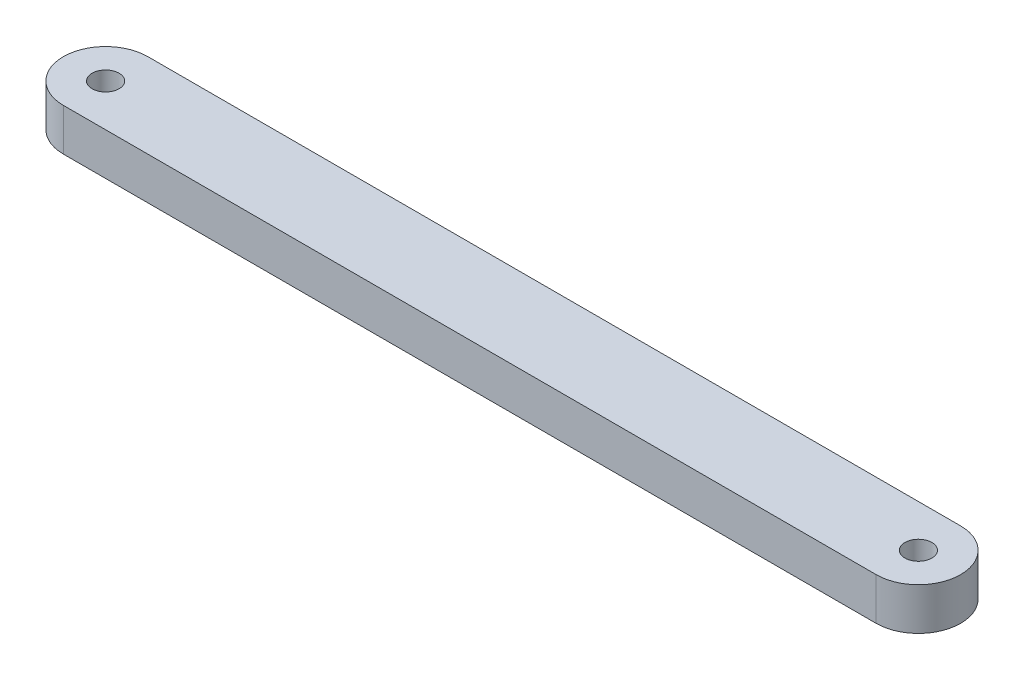
ISO-10303-21;
HEADER;
FILE_DESCRIPTION(('STEP AP214'),'2;1');
FILE_NAME('part.step','',(''),(''),'','','');
FILE_SCHEMA(('AUTOMOTIVE_DESIGN { 1 0 10303 214 1 1 1 1 }'));
ENDSEC;
DATA;
#1=APPLICATION_CONTEXT('core data for automotive mechanical design processes');
#2=APPLICATION_PROTOCOL_DEFINITION('international standard','automotive_design',2000,#1);
#3=PRODUCT_CONTEXT('',#1,'mechanical');
#4=PRODUCT('Part','Part','',(#3));
#5=PRODUCT_RELATED_PRODUCT_CATEGORY('part','',(#4));
#6=PRODUCT_DEFINITION_FORMATION('','',#4);
#7=PRODUCT_DEFINITION_CONTEXT('part definition',#1,'design');
#8=PRODUCT_DEFINITION('design','',#6,#7);
#9=PRODUCT_DEFINITION_SHAPE('','',#8);
#10=(LENGTH_UNIT() NAMED_UNIT(*) SI_UNIT(.MILLI.,.METRE.));
#11=(NAMED_UNIT(*) PLANE_ANGLE_UNIT() SI_UNIT($,.RADIAN.));
#12=(NAMED_UNIT(*) SI_UNIT($,.STERADIAN.) SOLID_ANGLE_UNIT());
#13=UNCERTAINTY_MEASURE_WITH_UNIT(LENGTH_MEASURE(1.E-05),#10,'distance_accuracy_value','');
#14=(GEOMETRIC_REPRESENTATION_CONTEXT(3) GLOBAL_UNCERTAINTY_ASSIGNED_CONTEXT((#13)) GLOBAL_UNIT_ASSIGNED_CONTEXT((#10,
#11,#12)) REPRESENTATION_CONTEXT('',''));
#15=CARTESIAN_POINT('',(0.,0.,0.));
#16=DIRECTION('',(0.,0.,1.));
#17=DIRECTION('',(1.,0.,0.));
#18=AXIS2_PLACEMENT_3D('',#15,#16,#17);
#19=CARTESIAN_POINT('',(-48.13,5.,0.));
#20=DIRECTION('',(0.,1.,0.));
#21=DIRECTION('',(0.,0.,1.));
#22=AXIS2_PLACEMENT_3D('',#19,#20,#21);
#23=PLANE('',#22);
#24=CARTESIAN_POINT('',(-48.13,5.,0.));
#25=DIRECTION('',(0.,1.,0.));
#26=DIRECTION('',(0.,0.,1.));
#27=AXIS2_PLACEMENT_3D('',#24,#25,#26);
#28=CIRCLE('',#27,1.6);
#29=CARTESIAN_POINT('',(-48.13,5.,1.6));
#30=VERTEX_POINT('',#29);
#31=EDGE_CURVE('E100',#30,#30,#28,.T.);
#32=ORIENTED_EDGE('',*,*,#31,.F.);
#33=EDGE_LOOP('',(#32));
#34=FACE_BOUND('',#33,.T.);
#35=CARTESIAN_POINT('',(-48.13,5.,0.));
#36=DIRECTION('',(0.,1.,0.));
#37=DIRECTION('',(0.,0.,1.));
#38=AXIS2_PLACEMENT_3D('',#35,#36,#37);
#39=CIRCLE('',#38,5.);
#40=CARTESIAN_POINT('',(-48.13,5.,-5.));
#41=VERTEX_POINT('',#40);
#42=CARTESIAN_POINT('',(-48.13,5.,5.));
#43=VERTEX_POINT('',#42);
#44=EDGE_CURVE('E85',#41,#43,#39,.T.);
#45=ORIENTED_EDGE('',*,*,#44,.T.);
#46=DIRECTION('',(1.,0.,0.));
#47=VECTOR('',#46,1.);
#48=CARTESIAN_POINT('',(-48.13,5.,5.));
#49=LINE('',#48,#47);
#50=CARTESIAN_POINT('',(48.13,5.,4.99999999999998));
#51=VERTEX_POINT('',#50);
#52=EDGE_CURVE('E80',#43,#51,#49,.T.);
#53=ORIENTED_EDGE('',*,*,#52,.T.);
#54=CARTESIAN_POINT('',(48.13,5.,0.));
#55=DIRECTION('',(0.,1.,0.));
#56=DIRECTION('',(0.,0.,1.));
#57=AXIS2_PLACEMENT_3D('',#54,#55,#56);
#58=CIRCLE('',#57,5.);
#59=CARTESIAN_POINT('',(48.13,5.,-5.00000000000002));
#60=VERTEX_POINT('',#59);
#61=EDGE_CURVE('E83',#51,#60,#58,.T.);
#62=ORIENTED_EDGE('',*,*,#61,.T.);
#63=DIRECTION('',(-1.,0.,0.));
#64=VECTOR('',#63,1.);
#65=CARTESIAN_POINT('',(-48.13,5.,-5.));
#66=LINE('',#65,#64);
#67=EDGE_CURVE('E50',#60,#41,#66,.T.);
#68=ORIENTED_EDGE('',*,*,#67,.T.);
#69=EDGE_LOOP('',(#45,#53,#62,#68));
#70=FACE_BOUND('',#69,.T.);
#71=CARTESIAN_POINT('',(48.13,5.,0.));
#72=DIRECTION('',(0.,1.,0.));
#73=DIRECTION('',(0.,0.,1.));
#74=AXIS2_PLACEMENT_3D('',#71,#72,#73);
#75=CIRCLE('',#74,1.6);
#76=CARTESIAN_POINT('',(48.13,5.,1.59999999999998));
#77=VERTEX_POINT('',#76);
#78=EDGE_CURVE('E115',#77,#77,#75,.T.);
#79=ORIENTED_EDGE('',*,*,#78,.F.);
#80=EDGE_LOOP('',(#79));
#81=FACE_BOUND('',#80,.T.);
#82=ADVANCED_FACE('F33',(#34,#70,#81),#23,.T.);
#83=CARTESIAN_POINT('',(-48.13,0.,0.));
#84=DIRECTION('',(0.,1.,0.));
#85=DIRECTION('',(0.,0.,1.));
#86=AXIS2_PLACEMENT_3D('',#83,#84,#85);
#87=PLANE('',#86);
#88=CARTESIAN_POINT('',(-48.13,0.,0.));
#89=DIRECTION('',(0.,1.,0.));
#90=DIRECTION('',(0.,0.,1.));
#91=AXIS2_PLACEMENT_3D('',#88,#89,#90);
#92=CIRCLE('',#91,5.);
#93=CARTESIAN_POINT('',(-48.13,0.,-5.));
#94=VERTEX_POINT('',#93);
#95=CARTESIAN_POINT('',(-48.13,0.,5.));
#96=VERTEX_POINT('',#95);
#97=EDGE_CURVE('E97',#94,#96,#92,.T.);
#98=ORIENTED_EDGE('',*,*,#97,.F.);
#99=DIRECTION('',(-1.,0.,0.));
#100=VECTOR('',#99,1.);
#101=CARTESIAN_POINT('',(-48.13,0.,-5.));
#102=LINE('',#101,#100);
#103=CARTESIAN_POINT('',(48.13,0.,-5.00000000000002));
#104=VERTEX_POINT('',#103);
#105=EDGE_CURVE('E73',#104,#94,#102,.T.);
#106=ORIENTED_EDGE('',*,*,#105,.F.);
#107=CARTESIAN_POINT('',(48.13,0.,0.));
#108=DIRECTION('',(0.,1.,0.));
#109=DIRECTION('',(0.,0.,1.));
#110=AXIS2_PLACEMENT_3D('',#107,#108,#109);
#111=CIRCLE('',#110,5.);
#112=CARTESIAN_POINT('',(48.13,0.,4.99999999999998));
#113=VERTEX_POINT('',#112);
#114=EDGE_CURVE('E67',#113,#104,#111,.T.);
#115=ORIENTED_EDGE('',*,*,#114,.F.);
#116=DIRECTION('',(1.,0.,0.));
#117=VECTOR('',#116,1.);
#118=CARTESIAN_POINT('',(-48.13,0.,5.));
#119=LINE('',#118,#117);
#120=EDGE_CURVE('E89',#96,#113,#119,.T.);
#121=ORIENTED_EDGE('',*,*,#120,.F.);
#122=EDGE_LOOP('',(#98,#106,#115,#121));
#123=FACE_BOUND('',#122,.T.);
#124=CARTESIAN_POINT('',(-48.13,0.,0.));
#125=DIRECTION('',(0.,1.,0.));
#126=DIRECTION('',(0.,0.,1.));
#127=AXIS2_PLACEMENT_3D('',#124,#125,#126);
#128=CIRCLE('',#127,1.6);
#129=CARTESIAN_POINT('',(-48.13,0.,1.6));
#130=VERTEX_POINT('',#129);
#131=EDGE_CURVE('E112',#130,#130,#128,.T.);
#132=ORIENTED_EDGE('',*,*,#131,.T.);
#133=EDGE_LOOP('',(#132));
#134=FACE_BOUND('',#133,.T.);
#135=CARTESIAN_POINT('',(48.13,0.,0.));
#136=DIRECTION('',(0.,1.,0.));
#137=DIRECTION('',(0.,0.,1.));
#138=AXIS2_PLACEMENT_3D('',#135,#136,#137);
#139=CIRCLE('',#138,1.6);
#140=CARTESIAN_POINT('',(48.13,0.,1.59999999999998));
#141=VERTEX_POINT('',#140);
#142=EDGE_CURVE('E118',#141,#141,#139,.T.);
#143=ORIENTED_EDGE('',*,*,#142,.T.);
#144=EDGE_LOOP('',(#143));
#145=FACE_BOUND('',#144,.T.);
#146=ADVANCED_FACE('F108',(#123,#134,#145),#87,.F.);
#147=CARTESIAN_POINT('',(-48.13,5.,0.));
#148=DIRECTION('',(0.,-1.,0.));
#149=DIRECTION('',(0.,0.,-1.));
#150=AXIS2_PLACEMENT_3D('',#147,#148,#149);
#151=CYLINDRICAL_SURFACE('',#150,5.);
#152=ORIENTED_EDGE('',*,*,#97,.T.);
#153=DIRECTION('',(0.,-1.,0.));
#154=VECTOR('',#153,1.);
#155=CARTESIAN_POINT('',(-48.13,5.,5.));
#156=LINE('',#155,#154);
#157=EDGE_CURVE('E11',#43,#96,#156,.T.);
#158=ORIENTED_EDGE('',*,*,#157,.F.);
#159=ORIENTED_EDGE('',*,*,#44,.F.);
#160=DIRECTION('',(0.,-1.,0.));
#161=VECTOR('',#160,1.);
#162=CARTESIAN_POINT('',(-48.13,5.,-5.));
#163=LINE('',#162,#161);
#164=EDGE_CURVE('E93',#41,#94,#163,.T.);
#165=ORIENTED_EDGE('',*,*,#164,.T.);
#166=EDGE_LOOP('',(#152,#158,#159,#165));
#167=FACE_BOUND('',#166,.T.);
#168=ADVANCED_FACE('F35',(#167),#151,.T.);
#169=CARTESIAN_POINT('',(-48.13,5.,5.));
#170=DIRECTION('',(0.,0.,-1.));
#171=DIRECTION('',(-1.,0.,0.));
#172=AXIS2_PLACEMENT_3D('',#169,#170,#171);
#173=PLANE('',#172);
#174=ORIENTED_EDGE('',*,*,#120,.T.);
#175=DIRECTION('',(0.,-1.,0.));
#176=VECTOR('',#175,1.);
#177=CARTESIAN_POINT('',(48.13,5.,4.99999999999998));
#178=LINE('',#177,#176);
#179=EDGE_CURVE('E42',#51,#113,#178,.T.);
#180=ORIENTED_EDGE('',*,*,#179,.F.);
#181=ORIENTED_EDGE('',*,*,#52,.F.);
#182=ORIENTED_EDGE('',*,*,#157,.T.);
#183=EDGE_LOOP('',(#174,#180,#181,#182));
#184=FACE_BOUND('',#183,.T.);
#185=ADVANCED_FACE('F88',(#184),#173,.F.);
#186=CARTESIAN_POINT('',(48.13,5.,0.));
#187=DIRECTION('',(0.,-1.,0.));
#188=DIRECTION('',(0.,0.,-1.));
#189=AXIS2_PLACEMENT_3D('',#186,#187,#188);
#190=CYLINDRICAL_SURFACE('',#189,5.);
#191=ORIENTED_EDGE('',*,*,#114,.T.);
#192=DIRECTION('',(0.,-1.,0.));
#193=VECTOR('',#192,1.);
#194=CARTESIAN_POINT('',(48.13,5.,-5.00000000000002));
#195=LINE('',#194,#193);
#196=EDGE_CURVE('E90',#60,#104,#195,.T.);
#197=ORIENTED_EDGE('',*,*,#196,.F.);
#198=ORIENTED_EDGE('',*,*,#61,.F.);
#199=ORIENTED_EDGE('',*,*,#179,.T.);
#200=EDGE_LOOP('',(#191,#197,#198,#199));
#201=FACE_BOUND('',#200,.T.);
#202=ADVANCED_FACE('F91',(#201),#190,.T.);
#203=CARTESIAN_POINT('',(-48.13,5.,-5.));
#204=DIRECTION('',(0.,0.,1.));
#205=DIRECTION('',(1.,0.,0.));
#206=AXIS2_PLACEMENT_3D('',#203,#204,#205);
#207=PLANE('',#206);
#208=ORIENTED_EDGE('',*,*,#105,.T.);
#209=ORIENTED_EDGE('',*,*,#164,.F.);
#210=ORIENTED_EDGE('',*,*,#67,.F.);
#211=ORIENTED_EDGE('',*,*,#196,.T.);
#212=EDGE_LOOP('',(#208,#209,#210,#211));
#213=FACE_BOUND('',#212,.T.);
#214=ADVANCED_FACE('F105',(#213),#207,.F.);
#215=CARTESIAN_POINT('',(-48.13,5.,0.));
#216=DIRECTION('',(0.,-1.,0.));
#217=DIRECTION('',(0.,0.,-1.));
#218=AXIS2_PLACEMENT_3D('',#215,#216,#217);
#219=CYLINDRICAL_SURFACE('',#218,1.6);
#220=ORIENTED_EDGE('',*,*,#31,.T.);
#221=EDGE_LOOP('',(#220));
#222=FACE_BOUND('',#221,.T.);
#223=ORIENTED_EDGE('',*,*,#131,.F.);
#224=EDGE_LOOP('',(#223));
#225=FACE_BOUND('',#224,.T.);
#226=ADVANCED_FACE('F135',(#222,#225),#219,.F.);
#227=CARTESIAN_POINT('',(48.13,5.,0.));
#228=DIRECTION('',(0.,-1.,0.));
#229=DIRECTION('',(0.,0.,-1.));
#230=AXIS2_PLACEMENT_3D('',#227,#228,#229);
#231=CYLINDRICAL_SURFACE('',#230,1.6);
#232=ORIENTED_EDGE('',*,*,#78,.T.);
#233=EDGE_LOOP('',(#232));
#234=FACE_BOUND('',#233,.T.);
#235=ORIENTED_EDGE('',*,*,#142,.F.);
#236=EDGE_LOOP('',(#235));
#237=FACE_BOUND('',#236,.T.);
#238=ADVANCED_FACE('F124',(#234,#237),#231,.F.);
#239=CLOSED_SHELL('',(#82,#146,#168,#185,#202,#214,#226,#238));
#240=MANIFOLD_SOLID_BREP('B2',#239);
#241=ADVANCED_BREP_SHAPE_REPRESENTATION('',(#18,#240),#14);
#242=SHAPE_DEFINITION_REPRESENTATION(#9,#241);
ENDSEC;
END-ISO-10303-21;
